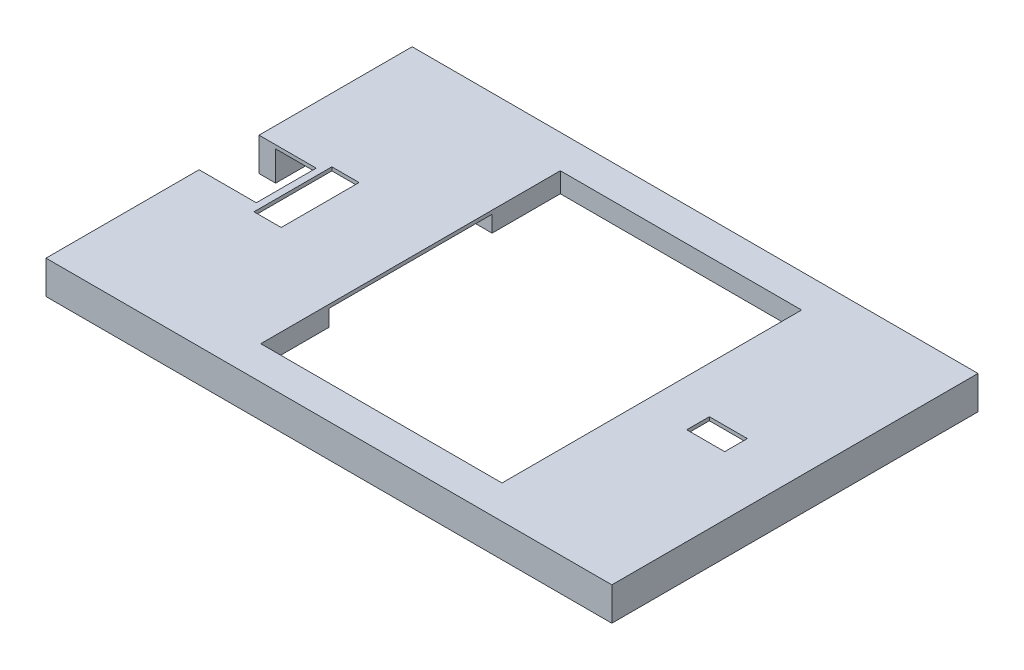
ISO-10303-21;
HEADER;
FILE_DESCRIPTION(('STEP AP214'),'2;1');
FILE_NAME('part.step','',(''),(''),'','','');
FILE_SCHEMA(('AUTOMOTIVE_DESIGN { 1 0 10303 214 1 1 1 1 }'));
ENDSEC;
DATA;
#1=APPLICATION_CONTEXT('core data for automotive mechanical design processes');
#2=APPLICATION_PROTOCOL_DEFINITION('international standard','automotive_design',2000,#1);
#3=PRODUCT_CONTEXT('',#1,'mechanical');
#4=PRODUCT('Part','Part','',(#3));
#5=PRODUCT_RELATED_PRODUCT_CATEGORY('part','',(#4));
#6=PRODUCT_DEFINITION_FORMATION('','',#4);
#7=PRODUCT_DEFINITION_CONTEXT('part definition',#1,'design');
#8=PRODUCT_DEFINITION('design','',#6,#7);
#9=PRODUCT_DEFINITION_SHAPE('','',#8);
#10=(LENGTH_UNIT() NAMED_UNIT(*) SI_UNIT(.MILLI.,.METRE.));
#11=(NAMED_UNIT(*) PLANE_ANGLE_UNIT() SI_UNIT($,.RADIAN.));
#12=(NAMED_UNIT(*) SI_UNIT($,.STERADIAN.) SOLID_ANGLE_UNIT());
#13=UNCERTAINTY_MEASURE_WITH_UNIT(LENGTH_MEASURE(1.E-05),#10,'distance_accuracy_value','');
#14=(GEOMETRIC_REPRESENTATION_CONTEXT(3) GLOBAL_UNCERTAINTY_ASSIGNED_CONTEXT((#13)) GLOBAL_UNIT_ASSIGNED_CONTEXT((#10,
#11,#12)) REPRESENTATION_CONTEXT('',''));
#15=CARTESIAN_POINT('',(0.,0.,0.));
#16=DIRECTION('',(0.,0.,1.));
#17=DIRECTION('',(1.,0.,0.));
#18=AXIS2_PLACEMENT_3D('',#15,#16,#17);
#19=CARTESIAN_POINT('',(0.,0.,0.));
#20=DIRECTION('',(0.,1.,0.));
#21=DIRECTION('',(0.,0.,1.));
#22=AXIS2_PLACEMENT_3D('',#19,#20,#21);
#23=PLANE('',#22);
#24=DIRECTION('',(1.,0.,0.));
#25=VECTOR('',#24,1.);
#26=CARTESIAN_POINT('',(2.49999999999997,0.,15.2500000001184));
#27=LINE('',#26,#25);
#28=CARTESIAN_POINT('',(2.5,0.,15.2500000001184));
#29=VERTEX_POINT('',#28);
#30=CARTESIAN_POINT('',(27.26,0.,15.2500000001184));
#31=VERTEX_POINT('',#30);
#32=EDGE_CURVE('E341',#29,#31,#27,.T.);
#33=ORIENTED_EDGE('',*,*,#32,.F.);
#34=DIRECTION('',(0.,0.,-1.));
#35=VECTOR('',#34,1.);
#36=CARTESIAN_POINT('',(2.5,0.,0.));
#37=LINE('',#36,#35);
#38=CARTESIAN_POINT('',(2.5,0.,2.50000000011836));
#39=VERTEX_POINT('',#38);
#40=EDGE_CURVE('E11',#29,#39,#37,.T.);
#41=ORIENTED_EDGE('',*,*,#40,.T.);
#42=DIRECTION('',(1.,0.,0.));
#43=VECTOR('',#42,1.);
#44=CARTESIAN_POINT('',(0.,0.,2.50000000011836));
#45=LINE('',#44,#43);
#46=CARTESIAN_POINT('',(82.5,0.,2.50000000011836));
#47=VERTEX_POINT('',#46);
#48=EDGE_CURVE('E283',#39,#47,#45,.T.);
#49=ORIENTED_EDGE('',*,*,#48,.T.);
#50=DIRECTION('',(0.,0.,1.));
#51=VECTOR('',#50,1.);
#52=CARTESIAN_POINT('',(82.5,0.,0.));
#53=LINE('',#52,#51);
#54=CARTESIAN_POINT('',(82.5,0.,15.2500000001184));
#55=VERTEX_POINT('',#54);
#56=EDGE_CURVE('E315',#47,#55,#53,.T.);
#57=ORIENTED_EDGE('',*,*,#56,.T.);
#58=DIRECTION('',(-1.,0.,0.));
#59=VECTOR('',#58,1.);
#60=CARTESIAN_POINT('',(0.,0.,15.2500000001184));
#61=LINE('',#60,#59);
#62=CARTESIAN_POINT('',(63.5,0.,15.2500000001184));
#63=VERTEX_POINT('',#62);
#64=EDGE_CURVE('E474',#55,#63,#61,.T.);
#65=ORIENTED_EDGE('',*,*,#64,.T.);
#66=DIRECTION('',(0.,0.,1.));
#67=VECTOR('',#66,1.);
#68=CARTESIAN_POINT('',(63.5,0.,0.));
#69=LINE('',#68,#67);
#70=CARTESIAN_POINT('',(63.5,0.,5.));
#71=VERTEX_POINT('',#70);
#72=EDGE_CURVE('E453',#71,#63,#69,.T.);
#73=ORIENTED_EDGE('',*,*,#72,.F.);
#74=DIRECTION('',(1.,0.,0.));
#75=VECTOR('',#74,1.);
#76=CARTESIAN_POINT('',(0.,0.,5.));
#77=LINE('',#76,#75);
#78=CARTESIAN_POINT('',(27.26,0.,5.));
#79=VERTEX_POINT('',#78);
#80=EDGE_CURVE('E398',#79,#71,#77,.T.);
#81=ORIENTED_EDGE('',*,*,#80,.F.);
#82=DIRECTION('',(0.,0.,1.));
#83=VECTOR('',#82,1.);
#84=CARTESIAN_POINT('',(27.26,0.,0.));
#85=LINE('',#84,#83);
#86=EDGE_CURVE('E403',#79,#31,#85,.T.);
#87=ORIENTED_EDGE('',*,*,#86,.T.);
#88=EDGE_LOOP('',(#33,#41,#49,#57,#65,#73,#81,#87));
#89=FACE_BOUND('',#88,.T.);
#90=ADVANCED_FACE('F41',(#89),#23,.F.);
#91=CARTESIAN_POINT('',(63.5,3.,0.));
#92=DIRECTION('',(1.,0.,0.));
#93=DIRECTION('',(0.,0.,-1.));
#94=AXIS2_PLACEMENT_3D('',#91,#92,#93);
#95=PLANE('',#94);
#96=DIRECTION('',(0.,1.,0.));
#97=VECTOR('',#96,1.);
#98=CARTESIAN_POINT('',(63.5,3.,39.7500000001184));
#99=LINE('',#98,#97);
#100=CARTESIAN_POINT('',(63.5,0.,39.7500000001184));
#101=VERTEX_POINT('',#100);
#102=CARTESIAN_POINT('',(63.5,2.46523087962948,39.7500000001184));
#103=VERTEX_POINT('',#102);
#104=EDGE_CURVE('E366',#101,#103,#99,.T.);
#105=ORIENTED_EDGE('',*,*,#104,.F.);
#106=CARTESIAN_POINT('',(63.5,0.,50.));
#107=VERTEX_POINT('',#106);
#108=EDGE_CURVE('E452',#101,#107,#69,.T.);
#109=ORIENTED_EDGE('',*,*,#108,.T.);
#110=DIRECTION('',(0.,-1.,0.));
#111=VECTOR('',#110,1.);
#112=CARTESIAN_POINT('',(63.5,3.,50.));
#113=LINE('',#112,#111);
#114=CARTESIAN_POINT('',(63.5,3.,50.));
#115=VERTEX_POINT('',#114);
#116=EDGE_CURVE('E468',#115,#107,#113,.T.);
#117=ORIENTED_EDGE('',*,*,#116,.F.);
#118=DIRECTION('',(0.,0.,1.));
#119=VECTOR('',#118,1.);
#120=CARTESIAN_POINT('',(63.5,3.,0.));
#121=LINE('',#120,#119);
#122=CARTESIAN_POINT('',(63.5,3.,5.));
#123=VERTEX_POINT('',#122);
#124=EDGE_CURVE('E441',#123,#115,#121,.T.);
#125=ORIENTED_EDGE('',*,*,#124,.F.);
#126=DIRECTION('',(0.,-1.,0.));
#127=VECTOR('',#126,1.);
#128=CARTESIAN_POINT('',(63.5,3.,5.));
#129=LINE('',#128,#127);
#130=EDGE_CURVE('E471',#123,#71,#129,.T.);
#131=ORIENTED_EDGE('',*,*,#130,.T.);
#132=ORIENTED_EDGE('',*,*,#72,.T.);
#133=DIRECTION('',(0.,1.,0.));
#134=VECTOR('',#133,1.);
#135=CARTESIAN_POINT('',(63.5,3.,15.2500000001184));
#136=LINE('',#135,#134);
#137=CARTESIAN_POINT('',(63.5,2.46523087962948,15.2500000001184));
#138=VERTEX_POINT('',#137);
#139=EDGE_CURVE('E360',#63,#138,#136,.T.);
#140=ORIENTED_EDGE('',*,*,#139,.T.);
#141=DIRECTION('',(0.,0.,1.));
#142=VECTOR('',#141,1.);
#143=CARTESIAN_POINT('',(63.5,2.46523087962948,0.));
#144=LINE('',#143,#142);
#145=EDGE_CURVE('E395',#138,#103,#144,.T.);
#146=ORIENTED_EDGE('',*,*,#145,.T.);
#147=EDGE_LOOP('',(#105,#109,#117,#125,#131,#132,#140,#146));
#148=FACE_BOUND('',#147,.T.);
#149=ADVANCED_FACE('F545',(#148),#95,.F.);
#150=CARTESIAN_POINT('',(27.26,3.,0.));
#151=DIRECTION('',(1.,0.,0.));
#152=DIRECTION('',(0.,0.,-1.));
#153=AXIS2_PLACEMENT_3D('',#150,#151,#152);
#154=PLANE('',#153);
#155=CARTESIAN_POINT('',(27.26,0.,39.7500000001184));
#156=VERTEX_POINT('',#155);
#157=CARTESIAN_POINT('',(27.26,0.,50.));
#158=VERTEX_POINT('',#157);
#159=EDGE_CURVE('E459',#156,#158,#85,.T.);
#160=ORIENTED_EDGE('',*,*,#159,.F.);
#161=DIRECTION('',(0.,1.,0.));
#162=VECTOR('',#161,1.);
#163=CARTESIAN_POINT('',(27.26,3.,39.7500000001184));
#164=LINE('',#163,#162);
#165=CARTESIAN_POINT('',(27.26,2.46523087962948,39.7500000001184));
#166=VERTEX_POINT('',#165);
#167=EDGE_CURVE('E363',#156,#166,#164,.T.);
#168=ORIENTED_EDGE('',*,*,#167,.T.);
#169=DIRECTION('',(0.,0.,1.));
#170=VECTOR('',#169,1.);
#171=CARTESIAN_POINT('',(27.26,2.46523087962948,0.));
#172=LINE('',#171,#170);
#173=CARTESIAN_POINT('',(27.26,2.46523087962948,15.2500000001184));
#174=VERTEX_POINT('',#173);
#175=EDGE_CURVE('E45',#174,#166,#172,.T.);
#176=ORIENTED_EDGE('',*,*,#175,.F.);
#177=DIRECTION('',(0.,1.,0.));
#178=VECTOR('',#177,1.);
#179=CARTESIAN_POINT('',(27.26,3.,15.2500000001184));
#180=LINE('',#179,#178);
#181=EDGE_CURVE('E358',#31,#174,#180,.T.);
#182=ORIENTED_EDGE('',*,*,#181,.F.);
#183=ORIENTED_EDGE('',*,*,#86,.F.);
#184=DIRECTION('',(0.,-1.,0.));
#185=VECTOR('',#184,1.);
#186=CARTESIAN_POINT('',(27.26,3.,5.));
#187=LINE('',#186,#185);
#188=CARTESIAN_POINT('',(27.26,3.,5.));
#189=VERTEX_POINT('',#188);
#190=EDGE_CURVE('E462',#189,#79,#187,.T.);
#191=ORIENTED_EDGE('',*,*,#190,.F.);
#192=DIRECTION('',(0.,0.,1.));
#193=VECTOR('',#192,1.);
#194=CARTESIAN_POINT('',(27.26,3.,0.));
#195=LINE('',#194,#193);
#196=CARTESIAN_POINT('',(27.26,3.,50.));
#197=VERTEX_POINT('',#196);
#198=EDGE_CURVE('E446',#189,#197,#195,.T.);
#199=ORIENTED_EDGE('',*,*,#198,.T.);
#200=DIRECTION('',(0.,-1.,0.));
#201=VECTOR('',#200,1.);
#202=CARTESIAN_POINT('',(27.26,3.,50.));
#203=LINE('',#202,#201);
#204=EDGE_CURVE('E464',#197,#158,#203,.T.);
#205=ORIENTED_EDGE('',*,*,#204,.T.);
#206=EDGE_LOOP('',(#160,#168,#176,#182,#183,#191,#199,#205));
#207=FACE_BOUND('',#206,.T.);
#208=ADVANCED_FACE('F555',(#207),#154,.T.);
#209=DIRECTION('',(-1.,0.,0.));
#210=VECTOR('',#209,1.);
#211=CARTESIAN_POINT('',(0.,0.,52.5000000001184));
#212=LINE('',#211,#210);
#213=CARTESIAN_POINT('',(82.5,0.,52.5000000001184));
#214=VERTEX_POINT('',#213);
#215=CARTESIAN_POINT('',(2.5,0.,52.5000000001184));
#216=VERTEX_POINT('',#215);
#217=EDGE_CURVE('E313',#214,#216,#212,.T.);
#218=ORIENTED_EDGE('',*,*,#217,.T.);
#219=CARTESIAN_POINT('',(2.5,0.,39.7500000001184));
#220=VERTEX_POINT('',#219);
#221=EDGE_CURVE('E52',#216,#220,#37,.T.);
#222=ORIENTED_EDGE('',*,*,#221,.T.);
#223=DIRECTION('',(1.,0.,0.));
#224=VECTOR('',#223,1.);
#225=CARTESIAN_POINT('',(2.49999999999997,0.,39.7500000001184));
#226=LINE('',#225,#224);
#227=EDGE_CURVE('E351',#220,#156,#226,.T.);
#228=ORIENTED_EDGE('',*,*,#227,.T.);
#229=ORIENTED_EDGE('',*,*,#159,.T.);
#230=DIRECTION('',(1.,0.,0.));
#231=VECTOR('',#230,1.);
#232=CARTESIAN_POINT('',(0.,0.,50.));
#233=LINE('',#232,#231);
#234=EDGE_CURVE('E456',#158,#107,#233,.T.);
#235=ORIENTED_EDGE('',*,*,#234,.T.);
#236=ORIENTED_EDGE('',*,*,#108,.F.);
#237=DIRECTION('',(-1.,0.,0.));
#238=VECTOR('',#237,1.);
#239=CARTESIAN_POINT('',(0.,0.,39.7500000001184));
#240=LINE('',#239,#238);
#241=CARTESIAN_POINT('',(82.5,0.,39.7500000001184));
#242=VERTEX_POINT('',#241);
#243=EDGE_CURVE('E516',#242,#101,#240,.T.);
#244=ORIENTED_EDGE('',*,*,#243,.F.);
#245=EDGE_CURVE('E50',#242,#214,#53,.T.);
#246=ORIENTED_EDGE('',*,*,#245,.T.);
#247=EDGE_LOOP('',(#218,#222,#228,#229,#235,#236,#244,#246));
#248=FACE_BOUND('',#247,.T.);
#249=ADVANCED_FACE('F526',(#248),#23,.F.);
#250=CARTESIAN_POINT('',(0.,3.,5.));
#251=DIRECTION('',(0.,0.,-1.));
#252=DIRECTION('',(-1.,0.,0.));
#253=AXIS2_PLACEMENT_3D('',#250,#251,#252);
#254=PLANE('',#253);
#255=ORIENTED_EDGE('',*,*,#80,.T.);
#256=ORIENTED_EDGE('',*,*,#130,.F.);
#257=DIRECTION('',(1.,0.,0.));
#258=VECTOR('',#257,1.);
#259=CARTESIAN_POINT('',(0.,3.,5.));
#260=LINE('',#259,#258);
#261=EDGE_CURVE('E438',#189,#123,#260,.T.);
#262=ORIENTED_EDGE('',*,*,#261,.F.);
#263=ORIENTED_EDGE('',*,*,#190,.T.);
#264=EDGE_LOOP('',(#255,#256,#262,#263));
#265=FACE_BOUND('',#264,.T.);
#266=ADVANCED_FACE('F550',(#265),#254,.F.);
#267=CARTESIAN_POINT('',(0.,3.,50.));
#268=DIRECTION('',(0.,0.,-1.));
#269=DIRECTION('',(-1.,0.,0.));
#270=AXIS2_PLACEMENT_3D('',#267,#268,#269);
#271=PLANE('',#270);
#272=ORIENTED_EDGE('',*,*,#234,.F.);
#273=ORIENTED_EDGE('',*,*,#204,.F.);
#274=DIRECTION('',(1.,0.,0.));
#275=VECTOR('',#274,1.);
#276=CARTESIAN_POINT('',(0.,3.,50.));
#277=LINE('',#276,#275);
#278=EDGE_CURVE('E443',#197,#115,#277,.T.);
#279=ORIENTED_EDGE('',*,*,#278,.T.);
#280=ORIENTED_EDGE('',*,*,#116,.T.);
#281=EDGE_LOOP('',(#272,#273,#279,#280));
#282=FACE_BOUND('',#281,.T.);
#283=ADVANCED_FACE('F606',(#282),#271,.T.);
#284=CARTESIAN_POINT('',(0.,3.,33.3500000000003));
#285=DIRECTION('',(0.,0.,1.));
#286=DIRECTION('',(1.,0.,0.));
#287=AXIS2_PLACEMENT_3D('',#284,#285,#286);
#288=PLANE('',#287);
#289=DIRECTION('',(0.,-1.,0.));
#290=VECTOR('',#289,1.);
#291=CARTESIAN_POINT('',(13.68,3.,33.3500000000003));
#292=LINE('',#291,#290);
#293=CARTESIAN_POINT('',(13.68,3.,33.3500000000003));
#294=VERTEX_POINT('',#293);
#295=CARTESIAN_POINT('',(13.68,2.46523087962948,33.3500000000003));
#296=VERTEX_POINT('',#295);
#297=EDGE_CURVE('E475',#294,#296,#292,.T.);
#298=ORIENTED_EDGE('',*,*,#297,.T.);
#299=DIRECTION('',(-1.,0.,0.));
#300=VECTOR('',#299,1.);
#301=CARTESIAN_POINT('',(0.,2.46523087962948,33.3500000000003));
#302=LINE('',#301,#300);
#303=CARTESIAN_POINT('',(9.59,2.46523087962948,33.3500000000003));
#304=VERTEX_POINT('',#303);
#305=EDGE_CURVE('E66',#296,#304,#302,.T.);
#306=ORIENTED_EDGE('',*,*,#305,.T.);
#307=DIRECTION('',(0.,-1.,0.));
#308=VECTOR('',#307,1.);
#309=CARTESIAN_POINT('',(9.59,3.,33.3500000000003));
#310=LINE('',#309,#308);
#311=CARTESIAN_POINT('',(9.59,3.,33.3500000000003));
#312=VERTEX_POINT('',#311);
#313=EDGE_CURVE('E465',#312,#304,#310,.T.);
#314=ORIENTED_EDGE('',*,*,#313,.F.);
#315=DIRECTION('',(-1.,0.,0.));
#316=VECTOR('',#315,1.);
#317=CARTESIAN_POINT('',(0.,3.,33.3500000000003));
#318=LINE('',#317,#316);
#319=EDGE_CURVE('E429',#294,#312,#318,.T.);
#320=ORIENTED_EDGE('',*,*,#319,.F.);
#321=EDGE_LOOP('',(#298,#306,#314,#320));
#322=FACE_BOUND('',#321,.T.);
#323=ADVANCED_FACE('F642',(#322),#288,.F.);
#324=CARTESIAN_POINT('',(9.59,3.,0.));
#325=DIRECTION('',(-1.,0.,0.));
#326=DIRECTION('',(0.,0.,1.));
#327=AXIS2_PLACEMENT_3D('',#324,#325,#326);
#328=PLANE('',#327);
#329=ORIENTED_EDGE('',*,*,#313,.T.);
#330=DIRECTION('',(0.,0.,-1.));
#331=VECTOR('',#330,1.);
#332=CARTESIAN_POINT('',(9.59,2.46523087962948,0.));
#333=LINE('',#332,#331);
#334=CARTESIAN_POINT('',(9.59,2.46523087962948,21.6500000000003));
#335=VERTEX_POINT('',#334);
#336=EDGE_CURVE('E391',#304,#335,#333,.T.);
#337=ORIENTED_EDGE('',*,*,#336,.T.);
#338=DIRECTION('',(0.,-1.,0.));
#339=VECTOR('',#338,1.);
#340=CARTESIAN_POINT('',(9.59,3.,21.6500000000003));
#341=LINE('',#340,#339);
#342=CARTESIAN_POINT('',(9.59,3.,21.6500000000003));
#343=VERTEX_POINT('',#342);
#344=EDGE_CURVE('E482',#343,#335,#341,.T.);
#345=ORIENTED_EDGE('',*,*,#344,.F.);
#346=DIRECTION('',(0.,0.,-1.));
#347=VECTOR('',#346,1.);
#348=CARTESIAN_POINT('',(9.59,3.,0.));
#349=LINE('',#348,#347);
#350=EDGE_CURVE('E432',#312,#343,#349,.T.);
#351=ORIENTED_EDGE('',*,*,#350,.F.);
#352=EDGE_LOOP('',(#329,#337,#345,#351));
#353=FACE_BOUND('',#352,.T.);
#354=ADVANCED_FACE('F653',(#353),#328,.F.);
#355=CARTESIAN_POINT('',(0.,3.,21.6500000000003));
#356=DIRECTION('',(0.,0.,-1.));
#357=DIRECTION('',(-1.,0.,0.));
#358=AXIS2_PLACEMENT_3D('',#355,#356,#357);
#359=PLANE('',#358);
#360=ORIENTED_EDGE('',*,*,#344,.T.);
#361=DIRECTION('',(1.,0.,0.));
#362=VECTOR('',#361,1.);
#363=CARTESIAN_POINT('',(0.,2.46523087962948,21.6500000000003));
#364=LINE('',#363,#362);
#365=CARTESIAN_POINT('',(13.68,2.46523087962948,21.6500000000003));
#366=VERTEX_POINT('',#365);
#367=EDGE_CURVE('E388',#335,#366,#364,.T.);
#368=ORIENTED_EDGE('',*,*,#367,.T.);
#369=DIRECTION('',(0.,-1.,0.));
#370=VECTOR('',#369,1.);
#371=CARTESIAN_POINT('',(13.68,3.,21.6500000000003));
#372=LINE('',#371,#370);
#373=CARTESIAN_POINT('',(13.68,3.,21.6500000000003));
#374=VERTEX_POINT('',#373);
#375=EDGE_CURVE('E478',#374,#366,#372,.T.);
#376=ORIENTED_EDGE('',*,*,#375,.F.);
#377=DIRECTION('',(1.,0.,0.));
#378=VECTOR('',#377,1.);
#379=CARTESIAN_POINT('',(0.,3.,21.6500000000003));
#380=LINE('',#379,#378);
#381=EDGE_CURVE('E434',#343,#374,#380,.T.);
#382=ORIENTED_EDGE('',*,*,#381,.F.);
#383=EDGE_LOOP('',(#360,#368,#376,#382));
#384=FACE_BOUND('',#383,.T.);
#385=ADVANCED_FACE('F649',(#384),#359,.F.);
#386=CARTESIAN_POINT('',(8.58999999999999,3.,0.));
#387=DIRECTION('',(1.,0.,0.));
#388=DIRECTION('',(0.,0.,-1.));
#389=AXIS2_PLACEMENT_3D('',#386,#387,#388);
#390=PLANE('',#389);
#391=DIRECTION('',(0.,-1.,0.));
#392=VECTOR('',#391,1.);
#393=CARTESIAN_POINT('',(8.59,3.,23.0000000000003));
#394=LINE('',#393,#392);
#395=CARTESIAN_POINT('',(8.59,3.,23.0000000000003));
#396=VERTEX_POINT('',#395);
#397=CARTESIAN_POINT('',(8.59,2.46523087962948,23.0000000000003));
#398=VERTEX_POINT('',#397);
#399=EDGE_CURVE('E487',#396,#398,#394,.T.);
#400=ORIENTED_EDGE('',*,*,#399,.T.);
#401=DIRECTION('',(0.,0.,1.));
#402=VECTOR('',#401,1.);
#403=CARTESIAN_POINT('',(8.58999999999999,2.46523087962948,0.));
#404=LINE('',#403,#402);
#405=CARTESIAN_POINT('',(8.59,2.46523087962948,32.0000000000003));
#406=VERTEX_POINT('',#405);
#407=EDGE_CURVE('E380',#398,#406,#404,.T.);
#408=ORIENTED_EDGE('',*,*,#407,.T.);
#409=DIRECTION('',(0.,-1.,0.));
#410=VECTOR('',#409,1.);
#411=CARTESIAN_POINT('',(8.59,3.,32.0000000000003));
#412=LINE('',#411,#410);
#413=CARTESIAN_POINT('',(8.59,3.,32.0000000000003));
#414=VERTEX_POINT('',#413);
#415=EDGE_CURVE('E479',#414,#406,#412,.T.);
#416=ORIENTED_EDGE('',*,*,#415,.F.);
#417=DIRECTION('',(0.,0.,1.));
#418=VECTOR('',#417,1.);
#419=CARTESIAN_POINT('',(8.58999999999999,3.,0.));
#420=LINE('',#419,#418);
#421=EDGE_CURVE('E410',#396,#414,#420,.T.);
#422=ORIENTED_EDGE('',*,*,#421,.F.);
#423=EDGE_LOOP('',(#400,#408,#416,#422));
#424=FACE_BOUND('',#423,.T.);
#425=ADVANCED_FACE('F652',(#424),#390,.F.);
#426=CARTESIAN_POINT('',(0.,3.,32.0000000000003));
#427=DIRECTION('',(0.,0.,1.));
#428=DIRECTION('',(1.,0.,0.));
#429=AXIS2_PLACEMENT_3D('',#426,#427,#428);
#430=PLANE('',#429);
#431=ORIENTED_EDGE('',*,*,#415,.T.);
#432=DIRECTION('',(-1.,0.,0.));
#433=VECTOR('',#432,1.);
#434=CARTESIAN_POINT('',(0.,2.46523087962948,32.0000000000003));
#435=LINE('',#434,#433);
#436=CARTESIAN_POINT('',(2.49999999999997,2.46523087962948,32.0000000000003));
#437=VERTEX_POINT('',#436);
#438=EDGE_CURVE('E383',#406,#437,#435,.T.);
#439=ORIENTED_EDGE('',*,*,#438,.T.);
#440=DIRECTION('',(0.,-1.,0.));
#441=VECTOR('',#440,1.);
#442=CARTESIAN_POINT('',(2.49999999999997,3.,32.0000000000003));
#443=LINE('',#442,#441);
#444=CARTESIAN_POINT('',(2.49999999999997,-2.,32.0000000000003));
#445=VERTEX_POINT('',#444);
#446=EDGE_CURVE('E356',#437,#445,#443,.T.);
#447=ORIENTED_EDGE('',*,*,#446,.T.);
#448=DIRECTION('',(1.,0.,0.));
#449=VECTOR('',#448,1.);
#450=CARTESIAN_POINT('',(0.,-2.,32.0000000000003));
#451=LINE('',#450,#449);
#452=CARTESIAN_POINT('',(0.,-2.,32.0000000000003));
#453=VERTEX_POINT('',#452);
#454=EDGE_CURVE('E282',#453,#445,#451,.T.);
#455=ORIENTED_EDGE('',*,*,#454,.F.);
#456=DIRECTION('',(0.,-1.,0.));
#457=VECTOR('',#456,1.);
#458=CARTESIAN_POINT('',(0.,3.,32.0000000000003));
#459=LINE('',#458,#457);
#460=CARTESIAN_POINT('',(0.,3.,32.0000000000003));
#461=VERTEX_POINT('',#460);
#462=EDGE_CURVE('E501',#461,#453,#459,.T.);
#463=ORIENTED_EDGE('',*,*,#462,.F.);
#464=DIRECTION('',(-1.,0.,0.));
#465=VECTOR('',#464,1.);
#466=CARTESIAN_POINT('',(0.,3.,32.0000000000003));
#467=LINE('',#466,#465);
#468=EDGE_CURVE('E413',#414,#461,#467,.T.);
#469=ORIENTED_EDGE('',*,*,#468,.F.);
#470=EDGE_LOOP('',(#431,#439,#447,#455,#463,#469));
#471=FACE_BOUND('',#470,.T.);
#472=ADVANCED_FACE('F599',(#471),#430,.F.);
#473=CARTESIAN_POINT('',(0.,3.,0.));
#474=DIRECTION('',(1.,0.,0.));
#475=DIRECTION('',(0.,0.,-1.));
#476=AXIS2_PLACEMENT_3D('',#473,#474,#475);
#477=PLANE('',#476);
#478=ORIENTED_EDGE('',*,*,#462,.T.);
#479=DIRECTION('',(0.,0.,-1.));
#480=VECTOR('',#479,1.);
#481=CARTESIAN_POINT('',(0.,-2.,0.));
#482=LINE('',#481,#480);
#483=CARTESIAN_POINT('',(0.,-2.,55.));
#484=VERTEX_POINT('',#483);
#485=EDGE_CURVE('E309',#484,#453,#482,.T.);
#486=ORIENTED_EDGE('',*,*,#485,.F.);
#487=DIRECTION('',(0.,-1.,0.));
#488=VECTOR('',#487,1.);
#489=CARTESIAN_POINT('',(0.,3.,55.));
#490=LINE('',#489,#488);
#491=CARTESIAN_POINT('',(0.,3.,55.));
#492=VERTEX_POINT('',#491);
#493=EDGE_CURVE('E499',#492,#484,#490,.T.);
#494=ORIENTED_EDGE('',*,*,#493,.F.);
#495=DIRECTION('',(0.,0.,1.));
#496=VECTOR('',#495,1.);
#497=CARTESIAN_POINT('',(0.,3.,0.));
#498=LINE('',#497,#496);
#499=EDGE_CURVE('E415',#461,#492,#498,.T.);
#500=ORIENTED_EDGE('',*,*,#499,.F.);
#501=EDGE_LOOP('',(#478,#486,#494,#500));
#502=FACE_BOUND('',#501,.T.);
#503=ADVANCED_FACE('F595',(#502),#477,.F.);
#504=CARTESIAN_POINT('',(0.,3.,55.));
#505=DIRECTION('',(0.,0.,-1.));
#506=DIRECTION('',(-1.,0.,0.));
#507=AXIS2_PLACEMENT_3D('',#504,#505,#506);
#508=PLANE('',#507);
#509=ORIENTED_EDGE('',*,*,#493,.T.);
#510=DIRECTION('',(-1.,0.,0.));
#511=VECTOR('',#510,1.);
#512=CARTESIAN_POINT('',(0.,-2.,55.));
#513=LINE('',#512,#511);
#514=CARTESIAN_POINT('',(85.,-2.,55.));
#515=VERTEX_POINT('',#514);
#516=EDGE_CURVE('E306',#515,#484,#513,.T.);
#517=ORIENTED_EDGE('',*,*,#516,.F.);
#518=DIRECTION('',(0.,-1.,0.));
#519=VECTOR('',#518,1.);
#520=CARTESIAN_POINT('',(85.,3.,55.));
#521=LINE('',#520,#519);
#522=CARTESIAN_POINT('',(85.,3.,55.));
#523=VERTEX_POINT('',#522);
#524=EDGE_CURVE('E497',#523,#515,#521,.T.);
#525=ORIENTED_EDGE('',*,*,#524,.F.);
#526=DIRECTION('',(1.,0.,0.));
#527=VECTOR('',#526,1.);
#528=CARTESIAN_POINT('',(0.,3.,55.));
#529=LINE('',#528,#527);
#530=EDGE_CURVE('E417',#492,#523,#529,.T.);
#531=ORIENTED_EDGE('',*,*,#530,.F.);
#532=EDGE_LOOP('',(#509,#517,#525,#531));
#533=FACE_BOUND('',#532,.T.);
#534=ADVANCED_FACE('F591',(#533),#508,.F.);
#535=CARTESIAN_POINT('',(85.,3.,0.));
#536=DIRECTION('',(1.,0.,0.));
#537=DIRECTION('',(0.,0.,-1.));
#538=AXIS2_PLACEMENT_3D('',#535,#536,#537);
#539=PLANE('',#538);
#540=ORIENTED_EDGE('',*,*,#524,.T.);
#541=DIRECTION('',(0.,0.,1.));
#542=VECTOR('',#541,1.);
#543=CARTESIAN_POINT('',(85.,-2.,0.));
#544=LINE('',#543,#542);
#545=CARTESIAN_POINT('',(85.,-2.,0.));
#546=VERTEX_POINT('',#545);
#547=EDGE_CURVE('E303',#546,#515,#544,.T.);
#548=ORIENTED_EDGE('',*,*,#547,.F.);
#549=DIRECTION('',(0.,-1.,0.));
#550=VECTOR('',#549,1.);
#551=CARTESIAN_POINT('',(85.,3.,0.));
#552=LINE('',#551,#550);
#553=CARTESIAN_POINT('',(85.,3.,0.));
#554=VERTEX_POINT('',#553);
#555=EDGE_CURVE('E495',#554,#546,#552,.T.);
#556=ORIENTED_EDGE('',*,*,#555,.F.);
#557=DIRECTION('',(0.,0.,1.));
#558=VECTOR('',#557,1.);
#559=CARTESIAN_POINT('',(85.,3.,0.));
#560=LINE('',#559,#558);
#561=EDGE_CURVE('E420',#554,#523,#560,.T.);
#562=ORIENTED_EDGE('',*,*,#561,.T.);
#563=EDGE_LOOP('',(#540,#548,#556,#562));
#564=FACE_BOUND('',#563,.T.);
#565=ADVANCED_FACE('F586',(#564),#539,.T.);
#566=CARTESIAN_POINT('',(0.,3.,0.));
#567=DIRECTION('',(0.,0.,-1.));
#568=DIRECTION('',(-1.,0.,0.));
#569=AXIS2_PLACEMENT_3D('',#566,#567,#568);
#570=PLANE('',#569);
#571=ORIENTED_EDGE('',*,*,#555,.T.);
#572=DIRECTION('',(1.,0.,0.));
#573=VECTOR('',#572,1.);
#574=CARTESIAN_POINT('',(0.,-2.,0.));
#575=LINE('',#574,#573);
#576=CARTESIAN_POINT('',(0.,-2.,0.));
#577=VERTEX_POINT('',#576);
#578=EDGE_CURVE('E300',#577,#546,#575,.T.);
#579=ORIENTED_EDGE('',*,*,#578,.F.);
#580=DIRECTION('',(0.,-1.,0.));
#581=VECTOR('',#580,1.);
#582=CARTESIAN_POINT('',(0.,3.,0.));
#583=LINE('',#582,#581);
#584=CARTESIAN_POINT('',(0.,3.,0.));
#585=VERTEX_POINT('',#584);
#586=EDGE_CURVE('E493',#585,#577,#583,.T.);
#587=ORIENTED_EDGE('',*,*,#586,.F.);
#588=DIRECTION('',(1.,0.,0.));
#589=VECTOR('',#588,1.);
#590=CARTESIAN_POINT('',(0.,3.,0.));
#591=LINE('',#590,#589);
#592=EDGE_CURVE('E423',#585,#554,#591,.T.);
#593=ORIENTED_EDGE('',*,*,#592,.T.);
#594=EDGE_LOOP('',(#571,#579,#587,#593));
#595=FACE_BOUND('',#594,.T.);
#596=ADVANCED_FACE('F582',(#595),#570,.T.);
#597=ORIENTED_EDGE('',*,*,#586,.T.);
#598=DIRECTION('',(0.,0.,-1.));
#599=VECTOR('',#598,1.);
#600=CARTESIAN_POINT('',(0.,-2.,0.));
#601=LINE('',#600,#599);
#602=CARTESIAN_POINT('',(0.,-2.,23.0000000000003));
#603=VERTEX_POINT('',#602);
#604=EDGE_CURVE('E297',#603,#577,#601,.T.);
#605=ORIENTED_EDGE('',*,*,#604,.F.);
#606=DIRECTION('',(0.,-1.,0.));
#607=VECTOR('',#606,1.);
#608=CARTESIAN_POINT('',(0.,3.,23.0000000000003));
#609=LINE('',#608,#607);
#610=CARTESIAN_POINT('',(0.,3.,23.0000000000003));
#611=VERTEX_POINT('',#610);
#612=EDGE_CURVE('E490',#611,#603,#609,.T.);
#613=ORIENTED_EDGE('',*,*,#612,.F.);
#614=EDGE_CURVE('E418',#585,#611,#498,.T.);
#615=ORIENTED_EDGE('',*,*,#614,.F.);
#616=EDGE_LOOP('',(#597,#605,#613,#615));
#617=FACE_BOUND('',#616,.T.);
#618=ADVANCED_FACE('F578',(#617),#477,.F.);
#619=CARTESIAN_POINT('',(70.45,3.,0.));
#620=DIRECTION('',(1.,0.,0.));
#621=DIRECTION('',(0.,0.,-1.));
#622=AXIS2_PLACEMENT_3D('',#619,#620,#621);
#623=PLANE('',#622);
#624=DIRECTION('',(0.,0.,1.));
#625=VECTOR('',#624,1.);
#626=CARTESIAN_POINT('',(70.45,2.46523087962948,0.));
#627=LINE('',#626,#625);
#628=CARTESIAN_POINT('',(70.45,2.46523087962948,25.8000000000003));
#629=VERTEX_POINT('',#628);
#630=CARTESIAN_POINT('',(70.45,2.46523087962948,29.2000000000003));
#631=VERTEX_POINT('',#630);
#632=EDGE_CURVE('E376',#629,#631,#627,.T.);
#633=ORIENTED_EDGE('',*,*,#632,.F.);
#634=DIRECTION('',(0.,-1.,0.));
#635=VECTOR('',#634,1.);
#636=CARTESIAN_POINT('',(70.45,3.,25.8000000000003));
#637=LINE('',#636,#635);
#638=CARTESIAN_POINT('',(70.45,3.,25.8000000000003));
#639=VERTEX_POINT('',#638);
#640=EDGE_CURVE('E491',#639,#629,#637,.T.);
#641=ORIENTED_EDGE('',*,*,#640,.F.);
#642=DIRECTION('',(0.,0.,1.));
#643=VECTOR('',#642,1.);
#644=CARTESIAN_POINT('',(70.45,3.,0.));
#645=LINE('',#644,#643);
#646=CARTESIAN_POINT('',(70.45,3.,29.2000000000003));
#647=VERTEX_POINT('',#646);
#648=EDGE_CURVE('E399',#639,#647,#645,.T.);
#649=ORIENTED_EDGE('',*,*,#648,.T.);
#650=DIRECTION('',(0.,-1.,0.));
#651=VECTOR('',#650,1.);
#652=CARTESIAN_POINT('',(70.45,3.,29.2000000000003));
#653=LINE('',#652,#651);
#654=EDGE_CURVE('E449',#647,#631,#653,.T.);
#655=ORIENTED_EDGE('',*,*,#654,.T.);
#656=EDGE_LOOP('',(#633,#641,#649,#655));
#657=FACE_BOUND('',#656,.T.);
#658=ADVANCED_FACE('F43',(#657),#623,.T.);
#659=CARTESIAN_POINT('',(0.,3.,25.8000000000003));
#660=DIRECTION('',(0.,0.,1.));
#661=DIRECTION('',(1.,0.,0.));
#662=AXIS2_PLACEMENT_3D('',#659,#660,#661);
#663=PLANE('',#662);
#664=DIRECTION('',(-1.,0.,0.));
#665=VECTOR('',#664,1.);
#666=CARTESIAN_POINT('',(0.,2.46523087962948,25.8000000000003));
#667=LINE('',#666,#665);
#668=CARTESIAN_POINT('',(76.15,2.46523087962948,25.8000000000003));
#669=VERTEX_POINT('',#668);
#670=EDGE_CURVE('E374',#669,#629,#667,.T.);
#671=ORIENTED_EDGE('',*,*,#670,.F.);
#672=DIRECTION('',(0.,-1.,0.));
#673=VECTOR('',#672,1.);
#674=CARTESIAN_POINT('',(76.15,3.,25.8000000000003));
#675=LINE('',#674,#673);
#676=CARTESIAN_POINT('',(76.15,3.,25.8000000000003));
#677=VERTEX_POINT('',#676);
#678=EDGE_CURVE('E510',#677,#669,#675,.T.);
#679=ORIENTED_EDGE('',*,*,#678,.F.);
#680=DIRECTION('',(-1.,0.,0.));
#681=VECTOR('',#680,1.);
#682=CARTESIAN_POINT('',(0.,3.,25.8000000000003));
#683=LINE('',#682,#681);
#684=EDGE_CURVE('E402',#677,#639,#683,.T.);
#685=ORIENTED_EDGE('',*,*,#684,.T.);
#686=ORIENTED_EDGE('',*,*,#640,.T.);
#687=EDGE_LOOP('',(#671,#679,#685,#686));
#688=FACE_BOUND('',#687,.T.);
#689=ADVANCED_FACE('F677',(#688),#663,.T.);
#690=CARTESIAN_POINT('',(76.15,3.,0.));
#691=DIRECTION('',(1.,0.,0.));
#692=DIRECTION('',(0.,0.,-1.));
#693=AXIS2_PLACEMENT_3D('',#690,#691,#692);
#694=PLANE('',#693);
#695=ORIENTED_EDGE('',*,*,#678,.T.);
#696=DIRECTION('',(0.,0.,1.));
#697=VECTOR('',#696,1.);
#698=CARTESIAN_POINT('',(76.15,2.46523087962948,0.));
#699=LINE('',#698,#697);
#700=CARTESIAN_POINT('',(76.15,2.46523087962948,29.2000000000003));
#701=VERTEX_POINT('',#700);
#702=EDGE_CURVE('E371',#669,#701,#699,.T.);
#703=ORIENTED_EDGE('',*,*,#702,.T.);
#704=DIRECTION('',(0.,-1.,0.));
#705=VECTOR('',#704,1.);
#706=CARTESIAN_POINT('',(76.15,3.,29.2000000000003));
#707=LINE('',#706,#705);
#708=CARTESIAN_POINT('',(76.15,3.,29.2000000000003));
#709=VERTEX_POINT('',#708);
#710=EDGE_CURVE('E507',#709,#701,#707,.T.);
#711=ORIENTED_EDGE('',*,*,#710,.F.);
#712=DIRECTION('',(0.,0.,1.));
#713=VECTOR('',#712,1.);
#714=CARTESIAN_POINT('',(76.15,3.,0.));
#715=LINE('',#714,#713);
#716=EDGE_CURVE('E406',#677,#709,#715,.T.);
#717=ORIENTED_EDGE('',*,*,#716,.F.);
#718=EDGE_LOOP('',(#695,#703,#711,#717));
#719=FACE_BOUND('',#718,.T.);
#720=ADVANCED_FACE('F647',(#719),#694,.F.);
#721=CARTESIAN_POINT('',(13.68,3.,0.));
#722=DIRECTION('',(1.,0.,0.));
#723=DIRECTION('',(0.,0.,-1.));
#724=AXIS2_PLACEMENT_3D('',#721,#722,#723);
#725=PLANE('',#724);
#726=ORIENTED_EDGE('',*,*,#375,.T.);
#727=DIRECTION('',(0.,0.,1.));
#728=VECTOR('',#727,1.);
#729=CARTESIAN_POINT('',(13.68,2.46523087962948,0.));
#730=LINE('',#729,#728);
#731=EDGE_CURVE('E386',#366,#296,#730,.T.);
#732=ORIENTED_EDGE('',*,*,#731,.T.);
#733=ORIENTED_EDGE('',*,*,#297,.F.);
#734=DIRECTION('',(0.,0.,1.));
#735=VECTOR('',#734,1.);
#736=CARTESIAN_POINT('',(13.68,3.,0.));
#737=LINE('',#736,#735);
#738=EDGE_CURVE('E436',#374,#294,#737,.T.);
#739=ORIENTED_EDGE('',*,*,#738,.F.);
#740=EDGE_LOOP('',(#726,#732,#733,#739));
#741=FACE_BOUND('',#740,.T.);
#742=ADVANCED_FACE('F644',(#741),#725,.F.);
#743=CARTESIAN_POINT('',(0.,3.,23.0000000000003));
#744=DIRECTION('',(0.,0.,1.));
#745=DIRECTION('',(1.,0.,0.));
#746=AXIS2_PLACEMENT_3D('',#743,#744,#745);
#747=PLANE('',#746);
#748=DIRECTION('',(-1.,0.,0.));
#749=VECTOR('',#748,1.);
#750=CARTESIAN_POINT('',(0.,2.46523087962948,23.0000000000003));
#751=LINE('',#750,#749);
#752=CARTESIAN_POINT('',(2.49999999999997,2.46523087962948,23.0000000000003));
#753=VERTEX_POINT('',#752);
#754=EDGE_CURVE('E378',#398,#753,#751,.T.);
#755=ORIENTED_EDGE('',*,*,#754,.F.);
#756=ORIENTED_EDGE('',*,*,#399,.F.);
#757=DIRECTION('',(-1.,0.,0.));
#758=VECTOR('',#757,1.);
#759=CARTESIAN_POINT('',(0.,3.,23.0000000000003));
#760=LINE('',#759,#758);
#761=EDGE_CURVE('E426',#396,#611,#760,.T.);
#762=ORIENTED_EDGE('',*,*,#761,.T.);
#763=ORIENTED_EDGE('',*,*,#612,.T.);
#764=DIRECTION('',(-1.,0.,0.));
#765=VECTOR('',#764,1.);
#766=CARTESIAN_POINT('',(0.,-2.,23.0000000000003));
#767=LINE('',#766,#765);
#768=CARTESIAN_POINT('',(2.49999999999997,-2.,23.0000000000003));
#769=VERTEX_POINT('',#768);
#770=EDGE_CURVE('E294',#769,#603,#767,.T.);
#771=ORIENTED_EDGE('',*,*,#770,.F.);
#772=DIRECTION('',(0.,-1.,0.));
#773=VECTOR('',#772,1.);
#774=CARTESIAN_POINT('',(2.49999999999997,3.,23.0000000000003));
#775=LINE('',#774,#773);
#776=EDGE_CURVE('E354',#753,#769,#775,.T.);
#777=ORIENTED_EDGE('',*,*,#776,.F.);
#778=EDGE_LOOP('',(#755,#756,#762,#763,#771,#777));
#779=FACE_BOUND('',#778,.T.);
#780=ADVANCED_FACE('F573',(#779),#747,.T.);
#781=CARTESIAN_POINT('',(0.,3.,29.2000000000004));
#782=DIRECTION('',(0.,0.,1.));
#783=DIRECTION('',(1.,0.,0.));
#784=AXIS2_PLACEMENT_3D('',#781,#782,#783);
#785=PLANE('',#784);
#786=ORIENTED_EDGE('',*,*,#710,.T.);
#787=DIRECTION('',(-1.,0.,0.));
#788=VECTOR('',#787,1.);
#789=CARTESIAN_POINT('',(0.,2.46523087962948,29.2000000000004));
#790=LINE('',#789,#788);
#791=EDGE_CURVE('E368',#701,#631,#790,.T.);
#792=ORIENTED_EDGE('',*,*,#791,.T.);
#793=ORIENTED_EDGE('',*,*,#654,.F.);
#794=DIRECTION('',(-1.,0.,0.));
#795=VECTOR('',#794,1.);
#796=CARTESIAN_POINT('',(0.,3.,29.2000000000004));
#797=LINE('',#796,#795);
#798=EDGE_CURVE('E408',#709,#647,#797,.T.);
#799=ORIENTED_EDGE('',*,*,#798,.F.);
#800=EDGE_LOOP('',(#786,#792,#793,#799));
#801=FACE_BOUND('',#800,.T.);
#802=ADVANCED_FACE('F612',(#801),#785,.F.);
#803=CARTESIAN_POINT('',(0.,3.,0.));
#804=DIRECTION('',(0.,1.,0.));
#805=DIRECTION('',(0.,0.,1.));
#806=AXIS2_PLACEMENT_3D('',#803,#804,#805);
#807=PLANE('',#806);
#808=ORIENTED_EDGE('',*,*,#648,.F.);
#809=ORIENTED_EDGE('',*,*,#684,.F.);
#810=ORIENTED_EDGE('',*,*,#716,.T.);
#811=ORIENTED_EDGE('',*,*,#798,.T.);
#812=EDGE_LOOP('',(#808,#809,#810,#811));
#813=FACE_BOUND('',#812,.T.);
#814=ORIENTED_EDGE('',*,*,#421,.T.);
#815=ORIENTED_EDGE('',*,*,#468,.T.);
#816=ORIENTED_EDGE('',*,*,#499,.T.);
#817=ORIENTED_EDGE('',*,*,#530,.T.);
#818=ORIENTED_EDGE('',*,*,#561,.F.);
#819=ORIENTED_EDGE('',*,*,#592,.F.);
#820=ORIENTED_EDGE('',*,*,#614,.T.);
#821=ORIENTED_EDGE('',*,*,#761,.F.);
#822=EDGE_LOOP('',(#814,#815,#816,#817,#818,#819,#820,#821));
#823=FACE_BOUND('',#822,.T.);
#824=ORIENTED_EDGE('',*,*,#319,.T.);
#825=ORIENTED_EDGE('',*,*,#350,.T.);
#826=ORIENTED_EDGE('',*,*,#381,.T.);
#827=ORIENTED_EDGE('',*,*,#738,.T.);
#828=EDGE_LOOP('',(#824,#825,#826,#827));
#829=FACE_BOUND('',#828,.T.);
#830=ORIENTED_EDGE('',*,*,#261,.T.);
#831=ORIENTED_EDGE('',*,*,#124,.T.);
#832=ORIENTED_EDGE('',*,*,#278,.F.);
#833=ORIENTED_EDGE('',*,*,#198,.F.);
#834=EDGE_LOOP('',(#830,#831,#832,#833));
#835=FACE_BOUND('',#834,.T.);
#836=ADVANCED_FACE('F610',(#813,#823,#829,#835),#807,.T.);
#837=CARTESIAN_POINT('',(82.5,0.,0.));
#838=DIRECTION('',(-1.,0.,0.));
#839=DIRECTION('',(0.,0.,1.));
#840=AXIS2_PLACEMENT_3D('',#837,#838,#839);
#841=PLANE('',#840);
#842=DIRECTION('',(0.,1.,0.));
#843=VECTOR('',#842,1.);
#844=CARTESIAN_POINT('',(82.5,0.,15.2500000001184));
#845=LINE('',#844,#843);
#846=CARTESIAN_POINT('',(82.5,2.46523087962948,15.2500000001184));
#847=VERTEX_POINT('',#846);
#848=EDGE_CURVE('E328',#55,#847,#845,.T.);
#849=ORIENTED_EDGE('',*,*,#848,.F.);
#850=ORIENTED_EDGE('',*,*,#56,.F.);
#851=DIRECTION('',(0.,1.,0.));
#852=VECTOR('',#851,1.);
#853=CARTESIAN_POINT('',(82.5,-2.,2.50000000011836));
#854=LINE('',#853,#852);
#855=CARTESIAN_POINT('',(82.5,-2.,2.50000000011836));
#856=VERTEX_POINT('',#855);
#857=EDGE_CURVE('E320',#856,#47,#854,.T.);
#858=ORIENTED_EDGE('',*,*,#857,.F.);
#859=DIRECTION('',(0.,0.,1.));
#860=VECTOR('',#859,1.);
#861=CARTESIAN_POINT('',(82.5,-2.,0.));
#862=LINE('',#861,#860);
#863=CARTESIAN_POINT('',(82.5,-2.,52.5000000001184));
#864=VERTEX_POINT('',#863);
#865=EDGE_CURVE('E287',#856,#864,#862,.T.);
#866=ORIENTED_EDGE('',*,*,#865,.T.);
#867=DIRECTION('',(0.,1.,0.));
#868=VECTOR('',#867,1.);
#869=CARTESIAN_POINT('',(82.5,-2.,52.5000000001184));
#870=LINE('',#869,#868);
#871=EDGE_CURVE('E271',#864,#214,#870,.T.);
#872=ORIENTED_EDGE('',*,*,#871,.T.);
#873=ORIENTED_EDGE('',*,*,#245,.F.);
#874=DIRECTION('',(0.,1.,0.));
#875=VECTOR('',#874,1.);
#876=CARTESIAN_POINT('',(82.5,0.,39.7500000001184));
#877=LINE('',#876,#875);
#878=CARTESIAN_POINT('',(82.5,2.46523087962948,39.7500000001184));
#879=VERTEX_POINT('',#878);
#880=EDGE_CURVE('E270',#242,#879,#877,.T.);
#881=ORIENTED_EDGE('',*,*,#880,.T.);
#882=DIRECTION('',(0.,0.,1.));
#883=VECTOR('',#882,1.);
#884=CARTESIAN_POINT('',(82.5,2.46523087962948,0.));
#885=LINE('',#884,#883);
#886=EDGE_CURVE('E325',#847,#879,#885,.T.);
#887=ORIENTED_EDGE('',*,*,#886,.F.);
#888=EDGE_LOOP('',(#849,#850,#858,#866,#872,#873,#881,#887));
#889=FACE_BOUND('',#888,.T.);
#890=ADVANCED_FACE('F530',(#889),#841,.T.);
#891=CARTESIAN_POINT('',(2.49999999999997,0.,15.2500000001184));
#892=DIRECTION('',(0.,0.,-1.));
#893=DIRECTION('',(-1.,0.,0.));
#894=AXIS2_PLACEMENT_3D('',#891,#892,#893);
#895=PLANE('',#894);
#896=ORIENTED_EDGE('',*,*,#64,.F.);
#897=ORIENTED_EDGE('',*,*,#848,.T.);
#898=DIRECTION('',(1.,0.,0.));
#899=VECTOR('',#898,1.);
#900=CARTESIAN_POINT('',(2.49999999999997,2.46523087962948,15.2500000001184));
#901=LINE('',#900,#899);
#902=EDGE_CURVE('E343',#138,#847,#901,.T.);
#903=ORIENTED_EDGE('',*,*,#902,.F.);
#904=ORIENTED_EDGE('',*,*,#139,.F.);
#905=EDGE_LOOP('',(#896,#897,#903,#904));
#906=FACE_BOUND('',#905,.T.);
#907=ADVANCED_FACE('F540',(#906),#895,.F.);
#908=CARTESIAN_POINT('',(2.49999999999997,0.,39.7500000001184));
#909=DIRECTION('',(0.,0.,-1.));
#910=DIRECTION('',(-1.,0.,0.));
#911=AXIS2_PLACEMENT_3D('',#908,#909,#910);
#912=PLANE('',#911);
#913=ORIENTED_EDGE('',*,*,#104,.T.);
#914=DIRECTION('',(1.,0.,0.));
#915=VECTOR('',#914,1.);
#916=CARTESIAN_POINT('',(2.49999999999997,2.46523087962948,39.7500000001184));
#917=LINE('',#916,#915);
#918=EDGE_CURVE('E347',#103,#879,#917,.T.);
#919=ORIENTED_EDGE('',*,*,#918,.T.);
#920=ORIENTED_EDGE('',*,*,#880,.F.);
#921=ORIENTED_EDGE('',*,*,#243,.T.);
#922=EDGE_LOOP('',(#913,#919,#920,#921));
#923=FACE_BOUND('',#922,.T.);
#924=ADVANCED_FACE('F532',(#923),#912,.T.);
#925=CARTESIAN_POINT('',(2.49999999999997,2.46523087962948,0.));
#926=DIRECTION('',(0.,1.,0.));
#927=DIRECTION('',(0.,0.,1.));
#928=AXIS2_PLACEMENT_3D('',#925,#926,#927);
#929=PLANE('',#928);
#930=ORIENTED_EDGE('',*,*,#632,.T.);
#931=ORIENTED_EDGE('',*,*,#791,.F.);
#932=ORIENTED_EDGE('',*,*,#702,.F.);
#933=ORIENTED_EDGE('',*,*,#670,.T.);
#934=EDGE_LOOP('',(#930,#931,#932,#933));
#935=FACE_BOUND('',#934,.T.);
#936=ORIENTED_EDGE('',*,*,#902,.T.);
#937=ORIENTED_EDGE('',*,*,#886,.T.);
#938=ORIENTED_EDGE('',*,*,#918,.F.);
#939=ORIENTED_EDGE('',*,*,#145,.F.);
#940=EDGE_LOOP('',(#936,#937,#938,#939));
#941=FACE_BOUND('',#940,.T.);
#942=ADVANCED_FACE('F535',(#935,#941),#929,.F.);
#943=ORIENTED_EDGE('',*,*,#407,.F.);
#944=ORIENTED_EDGE('',*,*,#754,.T.);
#945=DIRECTION('',(0.,0.,1.));
#946=VECTOR('',#945,1.);
#947=CARTESIAN_POINT('',(2.49999999999997,2.46523087962948,0.));
#948=LINE('',#947,#946);
#949=CARTESIAN_POINT('',(2.49999999999997,2.46523087962948,15.2500000001184));
#950=VERTEX_POINT('',#949);
#951=EDGE_CURVE('E335',#950,#753,#948,.T.);
#952=ORIENTED_EDGE('',*,*,#951,.F.);
#953=EDGE_CURVE('E344',#950,#174,#901,.T.);
#954=ORIENTED_EDGE('',*,*,#953,.T.);
#955=ORIENTED_EDGE('',*,*,#175,.T.);
#956=CARTESIAN_POINT('',(2.49999999999997,2.46523087962948,39.7500000001184));
#957=VERTEX_POINT('',#956);
#958=EDGE_CURVE('E348',#957,#166,#917,.T.);
#959=ORIENTED_EDGE('',*,*,#958,.F.);
#960=EDGE_CURVE('E334',#437,#957,#948,.T.);
#961=ORIENTED_EDGE('',*,*,#960,.F.);
#962=ORIENTED_EDGE('',*,*,#438,.F.);
#963=EDGE_LOOP('',(#943,#944,#952,#954,#955,#959,#961,#962));
#964=FACE_BOUND('',#963,.T.);
#965=ORIENTED_EDGE('',*,*,#731,.F.);
#966=ORIENTED_EDGE('',*,*,#367,.F.);
#967=ORIENTED_EDGE('',*,*,#336,.F.);
#968=ORIENTED_EDGE('',*,*,#305,.F.);
#969=EDGE_LOOP('',(#965,#966,#967,#968));
#970=FACE_BOUND('',#969,.T.);
#971=ADVANCED_FACE('F560',(#964,#970),#929,.F.);
#972=CARTESIAN_POINT('',(2.49999999999997,0.,0.));
#973=DIRECTION('',(-1.,0.,0.));
#974=DIRECTION('',(0.,0.,1.));
#975=AXIS2_PLACEMENT_3D('',#972,#973,#974);
#976=PLANE('',#975);
#977=ORIENTED_EDGE('',*,*,#960,.T.);
#978=DIRECTION('',(0.,1.,0.));
#979=VECTOR('',#978,1.);
#980=CARTESIAN_POINT('',(2.49999999999997,0.,39.7500000001184));
#981=LINE('',#980,#979);
#982=EDGE_CURVE('E331',#220,#957,#981,.T.);
#983=ORIENTED_EDGE('',*,*,#982,.F.);
#984=ORIENTED_EDGE('',*,*,#221,.F.);
#985=DIRECTION('',(0.,1.,0.));
#986=VECTOR('',#985,1.);
#987=CARTESIAN_POINT('',(2.5,-2.,52.5000000001184));
#988=LINE('',#987,#986);
#989=CARTESIAN_POINT('',(2.5,-2.,52.5000000001184));
#990=VERTEX_POINT('',#989);
#991=EDGE_CURVE('E262',#990,#216,#988,.T.);
#992=ORIENTED_EDGE('',*,*,#991,.F.);
#993=DIRECTION('',(0.,0.,-1.));
#994=VECTOR('',#993,1.);
#995=CARTESIAN_POINT('',(2.5,-2.,0.));
#996=LINE('',#995,#994);
#997=EDGE_CURVE('E265',#990,#445,#996,.T.);
#998=ORIENTED_EDGE('',*,*,#997,.T.);
#999=ORIENTED_EDGE('',*,*,#446,.F.);
#1000=EDGE_LOOP('',(#977,#983,#984,#992,#998,#999));
#1001=FACE_BOUND('',#1000,.T.);
#1002=ADVANCED_FACE('F264',(#1001),#976,.F.);
#1003=ORIENTED_EDGE('',*,*,#227,.F.);
#1004=ORIENTED_EDGE('',*,*,#982,.T.);
#1005=ORIENTED_EDGE('',*,*,#958,.T.);
#1006=ORIENTED_EDGE('',*,*,#167,.F.);
#1007=EDGE_LOOP('',(#1003,#1004,#1005,#1006));
#1008=FACE_BOUND('',#1007,.T.);
#1009=ADVANCED_FACE('F603',(#1008),#912,.T.);
#1010=ORIENTED_EDGE('',*,*,#181,.T.);
#1011=ORIENTED_EDGE('',*,*,#953,.F.);
#1012=DIRECTION('',(0.,1.,0.));
#1013=VECTOR('',#1012,1.);
#1014=CARTESIAN_POINT('',(2.49999999999997,0.,15.2500000001184));
#1015=LINE('',#1014,#1013);
#1016=EDGE_CURVE('E338',#29,#950,#1015,.T.);
#1017=ORIENTED_EDGE('',*,*,#1016,.F.);
#1018=ORIENTED_EDGE('',*,*,#32,.T.);
#1019=EDGE_LOOP('',(#1010,#1011,#1017,#1018));
#1020=FACE_BOUND('',#1019,.T.);
#1021=ADVANCED_FACE('F557',(#1020),#895,.F.);
#1022=ORIENTED_EDGE('',*,*,#776,.T.);
#1023=CARTESIAN_POINT('',(2.5,-2.,2.50000000011836));
#1024=VERTEX_POINT('',#1023);
#1025=EDGE_CURVE('E285',#769,#1024,#996,.T.);
#1026=ORIENTED_EDGE('',*,*,#1025,.T.);
#1027=DIRECTION('',(0.,1.,0.));
#1028=VECTOR('',#1027,1.);
#1029=CARTESIAN_POINT('',(2.5,-2.,2.50000000011836));
#1030=LINE('',#1029,#1028);
#1031=EDGE_CURVE('E311',#1024,#39,#1030,.T.);
#1032=ORIENTED_EDGE('',*,*,#1031,.T.);
#1033=ORIENTED_EDGE('',*,*,#40,.F.);
#1034=ORIENTED_EDGE('',*,*,#1016,.T.);
#1035=ORIENTED_EDGE('',*,*,#951,.T.);
#1036=EDGE_LOOP('',(#1022,#1026,#1032,#1033,#1034,#1035));
#1037=FACE_BOUND('',#1036,.T.);
#1038=ADVANCED_FACE('F564',(#1037),#976,.F.);
#1039=CARTESIAN_POINT('',(0.,-2.,52.5000000001184));
#1040=DIRECTION('',(0.,0.,-1.));
#1041=DIRECTION('',(-1.,0.,0.));
#1042=AXIS2_PLACEMENT_3D('',#1039,#1040,#1041);
#1043=PLANE('',#1042);
#1044=ORIENTED_EDGE('',*,*,#217,.F.);
#1045=ORIENTED_EDGE('',*,*,#871,.F.);
#1046=DIRECTION('',(-1.,0.,0.));
#1047=VECTOR('',#1046,1.);
#1048=CARTESIAN_POINT('',(0.,-2.,52.5000000001184));
#1049=LINE('',#1048,#1047);
#1050=EDGE_CURVE('E278',#864,#990,#1049,.T.);
#1051=ORIENTED_EDGE('',*,*,#1050,.T.);
#1052=ORIENTED_EDGE('',*,*,#991,.T.);
#1053=EDGE_LOOP('',(#1044,#1045,#1051,#1052));
#1054=FACE_BOUND('',#1053,.T.);
#1055=ADVANCED_FACE('F286',(#1054),#1043,.T.);
#1056=CARTESIAN_POINT('',(0.,-2.,2.50000000011836));
#1057=DIRECTION('',(0.,0.,1.));
#1058=DIRECTION('',(1.,0.,0.));
#1059=AXIS2_PLACEMENT_3D('',#1056,#1057,#1058);
#1060=PLANE('',#1059);
#1061=ORIENTED_EDGE('',*,*,#48,.F.);
#1062=ORIENTED_EDGE('',*,*,#1031,.F.);
#1063=DIRECTION('',(1.,0.,0.));
#1064=VECTOR('',#1063,1.);
#1065=CARTESIAN_POINT('',(0.,-2.,2.50000000011836));
#1066=LINE('',#1065,#1064);
#1067=EDGE_CURVE('E289',#1024,#856,#1066,.T.);
#1068=ORIENTED_EDGE('',*,*,#1067,.T.);
#1069=ORIENTED_EDGE('',*,*,#857,.T.);
#1070=EDGE_LOOP('',(#1061,#1062,#1068,#1069));
#1071=FACE_BOUND('',#1070,.T.);
#1072=ADVANCED_FACE('F567',(#1071),#1060,.T.);
#1073=CARTESIAN_POINT('',(0.,-2.,0.));
#1074=DIRECTION('',(0.,-1.,0.));
#1075=DIRECTION('',(0.,0.,-1.));
#1076=AXIS2_PLACEMENT_3D('',#1073,#1074,#1075);
#1077=PLANE('',#1076);
#1078=ORIENTED_EDGE('',*,*,#997,.F.);
#1079=ORIENTED_EDGE('',*,*,#1050,.F.);
#1080=ORIENTED_EDGE('',*,*,#865,.F.);
#1081=ORIENTED_EDGE('',*,*,#1067,.F.);
#1082=ORIENTED_EDGE('',*,*,#1025,.F.);
#1083=ORIENTED_EDGE('',*,*,#770,.T.);
#1084=ORIENTED_EDGE('',*,*,#604,.T.);
#1085=ORIENTED_EDGE('',*,*,#578,.T.);
#1086=ORIENTED_EDGE('',*,*,#547,.T.);
#1087=ORIENTED_EDGE('',*,*,#516,.T.);
#1088=ORIENTED_EDGE('',*,*,#485,.T.);
#1089=ORIENTED_EDGE('',*,*,#454,.T.);
#1090=EDGE_LOOP('',(#1078,#1079,#1080,#1081,#1082,#1083,#1084,#1085,#1086,#1087,#1088,#1089));
#1091=FACE_BOUND('',#1090,.T.);
#1092=ADVANCED_FACE('F276',(#1091),#1077,.T.);
#1093=CLOSED_SHELL('',(#90,#149,#208,#249,#266,#283,#323,#354,#385,#425,#472,#503,#534,#565,
#596,#618,#658,#689,#720,#742,#780,#802,#836,#890,#907,#924,#942,#971,#1002,#1009,#1021,#1038,
#1055,#1072,#1092));
#1094=MANIFOLD_SOLID_BREP('B2',#1093);
#1095=ADVANCED_BREP_SHAPE_REPRESENTATION('',(#18,#1094),#14);
#1096=SHAPE_DEFINITION_REPRESENTATION(#9,#1095);
ENDSEC;
END-ISO-10303-21;
